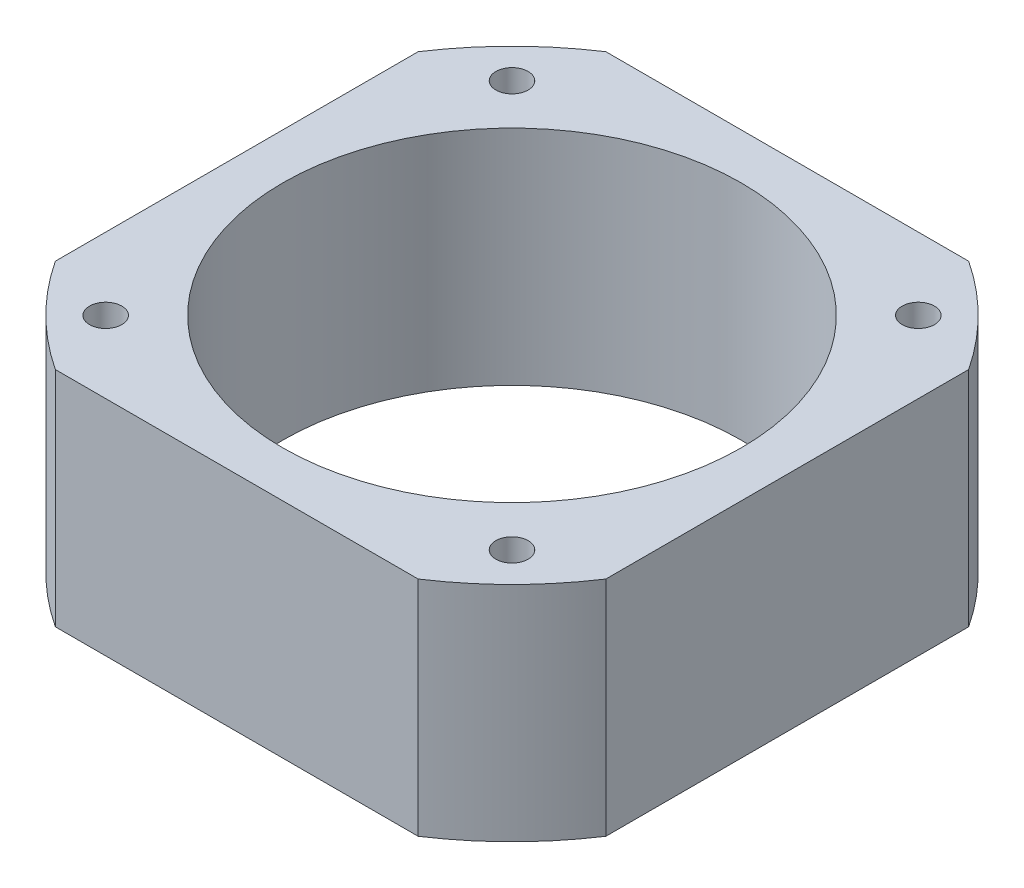
ISO-10303-21;
HEADER;
FILE_DESCRIPTION(('STEP AP214'),'2;1');
FILE_NAME('part.step','',(''),(''),'','','');
FILE_SCHEMA(('AUTOMOTIVE_DESIGN { 1 0 10303 214 1 1 1 1 }'));
ENDSEC;
DATA;
#1=APPLICATION_CONTEXT('core data for automotive mechanical design processes');
#2=APPLICATION_PROTOCOL_DEFINITION('international standard','automotive_design',2000,#1);
#3=PRODUCT_CONTEXT('',#1,'mechanical');
#4=PRODUCT('Part','Part','',(#3));
#5=PRODUCT_RELATED_PRODUCT_CATEGORY('part','',(#4));
#6=PRODUCT_DEFINITION_FORMATION('','',#4);
#7=PRODUCT_DEFINITION_CONTEXT('part definition',#1,'design');
#8=PRODUCT_DEFINITION('design','',#6,#7);
#9=PRODUCT_DEFINITION_SHAPE('','',#8);
#10=(LENGTH_UNIT() NAMED_UNIT(*) SI_UNIT(.MILLI.,.METRE.));
#11=(NAMED_UNIT(*) PLANE_ANGLE_UNIT() SI_UNIT($,.RADIAN.));
#12=(NAMED_UNIT(*) SI_UNIT($,.STERADIAN.) SOLID_ANGLE_UNIT());
#13=UNCERTAINTY_MEASURE_WITH_UNIT(LENGTH_MEASURE(1.E-05),#10,'distance_accuracy_value','');
#14=(GEOMETRIC_REPRESENTATION_CONTEXT(3) GLOBAL_UNCERTAINTY_ASSIGNED_CONTEXT((#13)) GLOBAL_UNIT_ASSIGNED_CONTEXT((#10,
#11,#12)) REPRESENTATION_CONTEXT('',''));
#15=CARTESIAN_POINT('',(0.,0.,0.));
#16=DIRECTION('',(0.,0.,1.));
#17=DIRECTION('',(1.,0.,0.));
#18=AXIS2_PLACEMENT_3D('',#15,#16,#17);
#19=CARTESIAN_POINT('',(15.5,0.,15.5));
#20=DIRECTION('',(0.,-1.,0.));
#21=DIRECTION('',(1.,0.,0.));
#22=AXIS2_PLACEMENT_3D('',#19,#20,#21);
#23=CYLINDRICAL_SURFACE('',#22,1.23);
#24=DIRECTION('',(0.,1.,0.));
#25=VECTOR('',#24,1.);
#26=CARTESIAN_POINT('',(16.73,0.,15.5));
#27=LINE('',#26,#25);
#28=CARTESIAN_POINT('',(16.73,0.,15.5));
#29=VERTEX_POINT('',#28);
#30=CARTESIAN_POINT('',(16.73,17.,15.5));
#31=VERTEX_POINT('',#30);
#32=EDGE_CURVE('E11',#29,#31,#27,.T.);
#33=ORIENTED_EDGE('',*,*,#32,.T.);
#34=CARTESIAN_POINT('',(15.5,17.,15.5));
#35=DIRECTION('',(0.,-1.,0.));
#36=DIRECTION('',(1.,0.,0.));
#37=AXIS2_PLACEMENT_3D('',#34,#35,#36);
#38=CIRCLE('',#37,1.23);
#39=EDGE_CURVE('E238',#31,#31,#38,.T.);
#40=ORIENTED_EDGE('',*,*,#39,.F.);
#41=ORIENTED_EDGE('',*,*,#32,.F.);
#42=CARTESIAN_POINT('',(15.5,0.,15.5));
#43=DIRECTION('',(0.,-1.,0.));
#44=DIRECTION('',(1.,0.,0.));
#45=AXIS2_PLACEMENT_3D('',#42,#43,#44);
#46=CIRCLE('',#45,1.23);
#47=EDGE_CURVE('E220',#29,#29,#46,.T.);
#48=ORIENTED_EDGE('',*,*,#47,.T.);
#49=EDGE_LOOP('',(#33,#40,#41,#48));
#50=FACE_BOUND('',#49,.T.);
#51=ADVANCED_FACE('F17',(#50),#23,.F.);
#52=CARTESIAN_POINT('',(0.,0.,0.));
#53=DIRECTION('',(0.,-1.,0.));
#54=DIRECTION('',(1.,0.,0.));
#55=AXIS2_PLACEMENT_3D('',#52,#53,#54);
#56=CYLINDRICAL_SURFACE('',#55,17.5);
#57=DIRECTION('',(0.,1.,0.));
#58=VECTOR('',#57,1.);
#59=CARTESIAN_POINT('',(17.5,0.,0.));
#60=LINE('',#59,#58);
#61=CARTESIAN_POINT('',(17.5,0.,0.));
#62=VERTEX_POINT('',#61);
#63=CARTESIAN_POINT('',(17.5,17.,0.));
#64=VERTEX_POINT('',#63);
#65=EDGE_CURVE('E28',#62,#64,#60,.T.);
#66=ORIENTED_EDGE('',*,*,#65,.T.);
#67=CARTESIAN_POINT('',(0.,17.,0.));
#68=DIRECTION('',(0.,1.,0.));
#69=DIRECTION('',(1.,0.,0.));
#70=AXIS2_PLACEMENT_3D('',#67,#68,#69);
#71=CIRCLE('',#70,17.5);
#72=EDGE_CURVE('E235',#64,#64,#71,.T.);
#73=ORIENTED_EDGE('',*,*,#72,.T.);
#74=ORIENTED_EDGE('',*,*,#65,.F.);
#75=CARTESIAN_POINT('',(0.,0.,0.));
#76=DIRECTION('',(0.,1.,0.));
#77=DIRECTION('',(1.,0.,0.));
#78=AXIS2_PLACEMENT_3D('',#75,#76,#77);
#79=CIRCLE('',#78,17.5);
#80=EDGE_CURVE('E248',#62,#62,#79,.T.);
#81=ORIENTED_EDGE('',*,*,#80,.F.);
#82=EDGE_LOOP('',(#66,#73,#74,#81));
#83=FACE_BOUND('',#82,.T.);
#84=ADVANCED_FACE('F528',(#83),#56,.F.);
#85=CARTESIAN_POINT('',(15.5,0.,-15.5));
#86=DIRECTION('',(0.,-1.,0.));
#87=DIRECTION('',(1.,0.,0.));
#88=AXIS2_PLACEMENT_3D('',#85,#86,#87);
#89=CYLINDRICAL_SURFACE('',#88,1.23);
#90=DIRECTION('',(0.,1.,0.));
#91=VECTOR('',#90,1.);
#92=CARTESIAN_POINT('',(16.73,0.,-15.5));
#93=LINE('',#92,#91);
#94=CARTESIAN_POINT('',(16.73,0.,-15.5));
#95=VERTEX_POINT('',#94);
#96=CARTESIAN_POINT('',(16.73,17.,-15.5));
#97=VERTEX_POINT('',#96);
#98=EDGE_CURVE('E69',#95,#97,#93,.T.);
#99=ORIENTED_EDGE('',*,*,#98,.T.);
#100=CARTESIAN_POINT('',(15.5,17.,-15.5));
#101=DIRECTION('',(0.,-1.,0.));
#102=DIRECTION('',(1.,0.,0.));
#103=AXIS2_PLACEMENT_3D('',#100,#101,#102);
#104=CIRCLE('',#103,1.23);
#105=EDGE_CURVE('E206',#97,#97,#104,.T.);
#106=ORIENTED_EDGE('',*,*,#105,.F.);
#107=ORIENTED_EDGE('',*,*,#98,.F.);
#108=CARTESIAN_POINT('',(15.5,0.,-15.5));
#109=DIRECTION('',(0.,-1.,0.));
#110=DIRECTION('',(1.,0.,0.));
#111=AXIS2_PLACEMENT_3D('',#108,#109,#110);
#112=CIRCLE('',#111,1.23);
#113=EDGE_CURVE('E245',#95,#95,#112,.T.);
#114=ORIENTED_EDGE('',*,*,#113,.T.);
#115=EDGE_LOOP('',(#99,#106,#107,#114));
#116=FACE_BOUND('',#115,.T.);
#117=ADVANCED_FACE('F19',(#116),#89,.F.);
#118=CARTESIAN_POINT('',(-15.5,0.,15.5));
#119=DIRECTION('',(0.,-1.,0.));
#120=DIRECTION('',(1.,0.,0.));
#121=AXIS2_PLACEMENT_3D('',#118,#119,#120);
#122=CYLINDRICAL_SURFACE('',#121,1.23);
#123=DIRECTION('',(0.,1.,0.));
#124=VECTOR('',#123,1.);
#125=CARTESIAN_POINT('',(-14.27,0.,15.5));
#126=LINE('',#125,#124);
#127=CARTESIAN_POINT('',(-14.27,0.,15.5));
#128=VERTEX_POINT('',#127);
#129=CARTESIAN_POINT('',(-14.27,17.,15.5));
#130=VERTEX_POINT('',#129);
#131=EDGE_CURVE('E81',#128,#130,#126,.T.);
#132=ORIENTED_EDGE('',*,*,#131,.T.);
#133=CARTESIAN_POINT('',(-15.5,17.,15.5));
#134=DIRECTION('',(0.,-1.,0.));
#135=DIRECTION('',(1.,0.,0.));
#136=AXIS2_PLACEMENT_3D('',#133,#134,#135);
#137=CIRCLE('',#136,1.23);
#138=EDGE_CURVE('E204',#130,#130,#137,.T.);
#139=ORIENTED_EDGE('',*,*,#138,.F.);
#140=ORIENTED_EDGE('',*,*,#131,.F.);
#141=CARTESIAN_POINT('',(-15.5,0.,15.5));
#142=DIRECTION('',(0.,-1.,0.));
#143=DIRECTION('',(1.,0.,0.));
#144=AXIS2_PLACEMENT_3D('',#141,#142,#143);
#145=CIRCLE('',#144,1.23);
#146=EDGE_CURVE('E249',#128,#128,#145,.T.);
#147=ORIENTED_EDGE('',*,*,#146,.T.);
#148=EDGE_LOOP('',(#132,#139,#140,#147));
#149=FACE_BOUND('',#148,.T.);
#150=ADVANCED_FACE('F510',(#149),#122,.F.);
#151=CARTESIAN_POINT('',(-15.5,0.,-15.5));
#152=DIRECTION('',(0.,-1.,0.));
#153=DIRECTION('',(1.,0.,0.));
#154=AXIS2_PLACEMENT_3D('',#151,#152,#153);
#155=CYLINDRICAL_SURFACE('',#154,1.23);
#156=DIRECTION('',(0.,1.,0.));
#157=VECTOR('',#156,1.);
#158=CARTESIAN_POINT('',(-14.27,0.,-15.5));
#159=LINE('',#158,#157);
#160=CARTESIAN_POINT('',(-14.27,0.,-15.5));
#161=VERTEX_POINT('',#160);
#162=CARTESIAN_POINT('',(-14.27,17.,-15.5));
#163=VERTEX_POINT('',#162);
#164=EDGE_CURVE('E258',#161,#163,#159,.T.);
#165=ORIENTED_EDGE('',*,*,#164,.T.);
#166=CARTESIAN_POINT('',(-15.5,17.,-15.5));
#167=DIRECTION('',(0.,-1.,0.));
#168=DIRECTION('',(1.,0.,0.));
#169=AXIS2_PLACEMENT_3D('',#166,#167,#168);
#170=CIRCLE('',#169,1.23);
#171=EDGE_CURVE('E207',#163,#163,#170,.T.);
#172=ORIENTED_EDGE('',*,*,#171,.F.);
#173=ORIENTED_EDGE('',*,*,#164,.F.);
#174=CARTESIAN_POINT('',(-15.5,0.,-15.5));
#175=DIRECTION('',(0.,-1.,0.));
#176=DIRECTION('',(1.,0.,0.));
#177=AXIS2_PLACEMENT_3D('',#174,#175,#176);
#178=CIRCLE('',#177,1.23);
#179=EDGE_CURVE('E213',#161,#161,#178,.T.);
#180=ORIENTED_EDGE('',*,*,#179,.T.);
#181=EDGE_LOOP('',(#165,#172,#173,#180));
#182=FACE_BOUND('',#181,.T.);
#183=ADVANCED_FACE('F501',(#182),#155,.F.);
#184=CARTESIAN_POINT('',(-13.83916543726,0.,21.));
#185=DIRECTION('',(0.,0.,-1.));
#186=DIRECTION('',(-1.,0.,0.));
#187=AXIS2_PLACEMENT_3D('',#184,#185,#186);
#188=PLANE('',#187);
#189=DIRECTION('',(1.,0.,0.));
#190=VECTOR('',#189,1.);
#191=CARTESIAN_POINT('',(-13.83916543726,0.,21.));
#192=LINE('',#191,#190);
#193=CARTESIAN_POINT('',(-13.83916543726,0.,21.));
#194=VERTEX_POINT('',#193);
#195=CARTESIAN_POINT('',(13.839165437265,0.,21.));
#196=VERTEX_POINT('',#195);
#197=EDGE_CURVE('E203',#194,#196,#192,.T.);
#198=ORIENTED_EDGE('',*,*,#197,.T.);
#199=DIRECTION('',(0.,1.,0.));
#200=VECTOR('',#199,1.);
#201=CARTESIAN_POINT('',(13.839165437265,0.,21.));
#202=LINE('',#201,#200);
#203=CARTESIAN_POINT('',(13.839165437265,17.,21.));
#204=VERTEX_POINT('',#203);
#205=EDGE_CURVE('E196',#196,#204,#202,.T.);
#206=ORIENTED_EDGE('',*,*,#205,.T.);
#207=DIRECTION('',(1.,0.,0.));
#208=VECTOR('',#207,1.);
#209=CARTESIAN_POINT('',(-13.83916543726,17.,21.));
#210=LINE('',#209,#208);
#211=CARTESIAN_POINT('',(-13.83916543726,17.,21.));
#212=VERTEX_POINT('',#211);
#213=EDGE_CURVE('E189',#212,#204,#210,.T.);
#214=ORIENTED_EDGE('',*,*,#213,.F.);
#215=DIRECTION('',(0.,1.,0.));
#216=VECTOR('',#215,1.);
#217=CARTESIAN_POINT('',(-13.83916543726,0.,21.));
#218=LINE('',#217,#216);
#219=EDGE_CURVE('E199',#194,#212,#218,.T.);
#220=ORIENTED_EDGE('',*,*,#219,.F.);
#221=EDGE_LOOP('',(#198,#206,#214,#220));
#222=FACE_BOUND('',#221,.T.);
#223=ADVANCED_FACE('F300',(#222),#188,.F.);
#224=CARTESIAN_POINT('',(0.,0.,0.));
#225=DIRECTION('',(0.,-1.,0.));
#226=DIRECTION('',(1.,0.,0.));
#227=AXIS2_PLACEMENT_3D('',#224,#225,#226);
#228=CYLINDRICAL_SURFACE('',#227,25.15);
#229=CARTESIAN_POINT('',(0.,0.,0.));
#230=DIRECTION('',(0.,1.,0.));
#231=DIRECTION('',(1.,0.,0.));
#232=AXIS2_PLACEMENT_3D('',#229,#230,#231);
#233=CIRCLE('',#232,25.15);
#234=CARTESIAN_POINT('',(-21.,0.,13.839165437265));
#235=VERTEX_POINT('',#234);
#236=EDGE_CURVE('E214',#235,#194,#233,.T.);
#237=ORIENTED_EDGE('',*,*,#236,.T.);
#238=ORIENTED_EDGE('',*,*,#219,.T.);
#239=CARTESIAN_POINT('',(0.,17.,0.));
#240=DIRECTION('',(0.,1.,0.));
#241=DIRECTION('',(1.,0.,0.));
#242=AXIS2_PLACEMENT_3D('',#239,#240,#241);
#243=CIRCLE('',#242,25.15);
#244=CARTESIAN_POINT('',(-21.,17.,13.839165437265));
#245=VERTEX_POINT('',#244);
#246=EDGE_CURVE('E219',#245,#212,#243,.T.);
#247=ORIENTED_EDGE('',*,*,#246,.F.);
#248=DIRECTION('',(0.,1.,0.));
#249=VECTOR('',#248,1.);
#250=CARTESIAN_POINT('',(-21.,0.,13.839165437265));
#251=LINE('',#250,#249);
#252=EDGE_CURVE('E200',#235,#245,#251,.T.);
#253=ORIENTED_EDGE('',*,*,#252,.F.);
#254=EDGE_LOOP('',(#237,#238,#247,#253));
#255=FACE_BOUND('',#254,.T.);
#256=ADVANCED_FACE('F293',(#255),#228,.T.);
#257=CARTESIAN_POINT('',(0.,0.,0.));
#258=DIRECTION('',(0.,-1.,0.));
#259=DIRECTION('',(1.,0.,0.));
#260=AXIS2_PLACEMENT_3D('',#257,#258,#259);
#261=CYLINDRICAL_SURFACE('',#260,25.15);
#262=CARTESIAN_POINT('',(0.,0.,0.));
#263=DIRECTION('',(0.,1.,0.));
#264=DIRECTION('',(1.,0.,0.));
#265=AXIS2_PLACEMENT_3D('',#262,#263,#264);
#266=CIRCLE('',#265,25.15);
#267=CARTESIAN_POINT('',(21.,0.,13.839165437265));
#268=VERTEX_POINT('',#267);
#269=EDGE_CURVE('E167',#196,#268,#266,.T.);
#270=ORIENTED_EDGE('',*,*,#269,.T.);
#271=DIRECTION('',(0.,1.,0.));
#272=VECTOR('',#271,1.);
#273=CARTESIAN_POINT('',(21.,0.,13.839165437265));
#274=LINE('',#273,#272);
#275=CARTESIAN_POINT('',(21.,17.,13.839165437265));
#276=VERTEX_POINT('',#275);
#277=EDGE_CURVE('E163',#268,#276,#274,.T.);
#278=ORIENTED_EDGE('',*,*,#277,.T.);
#279=CARTESIAN_POINT('',(0.,17.,0.));
#280=DIRECTION('',(0.,1.,0.));
#281=DIRECTION('',(1.,0.,0.));
#282=AXIS2_PLACEMENT_3D('',#279,#280,#281);
#283=CIRCLE('',#282,25.15);
#284=EDGE_CURVE('E191',#204,#276,#283,.T.);
#285=ORIENTED_EDGE('',*,*,#284,.F.);
#286=ORIENTED_EDGE('',*,*,#205,.F.);
#287=EDGE_LOOP('',(#270,#278,#285,#286));
#288=FACE_BOUND('',#287,.T.);
#289=ADVANCED_FACE('F473',(#288),#261,.T.);
#290=CARTESIAN_POINT('',(-21.,0.,-13.83916543726));
#291=DIRECTION('',(1.,0.,0.));
#292=DIRECTION('',(0.,1.,0.));
#293=AXIS2_PLACEMENT_3D('',#290,#291,#292);
#294=PLANE('',#293);
#295=DIRECTION('',(0.,0.,1.));
#296=VECTOR('',#295,1.);
#297=CARTESIAN_POINT('',(-21.,0.,-13.83916543726));
#298=LINE('',#297,#296);
#299=CARTESIAN_POINT('',(-21.,0.,-13.83916543726));
#300=VERTEX_POINT('',#299);
#301=EDGE_CURVE('E209',#300,#235,#298,.T.);
#302=ORIENTED_EDGE('',*,*,#301,.T.);
#303=ORIENTED_EDGE('',*,*,#252,.T.);
#304=DIRECTION('',(0.,0.,1.));
#305=VECTOR('',#304,1.);
#306=CARTESIAN_POINT('',(-21.,17.,-13.83916543726));
#307=LINE('',#306,#305);
#308=CARTESIAN_POINT('',(-21.,17.,-13.83916543726));
#309=VERTEX_POINT('',#308);
#310=EDGE_CURVE('E215',#309,#245,#307,.T.);
#311=ORIENTED_EDGE('',*,*,#310,.F.);
#312=DIRECTION('',(0.,1.,0.));
#313=VECTOR('',#312,1.);
#314=CARTESIAN_POINT('',(-21.,0.,-13.83916543726));
#315=LINE('',#314,#313);
#316=EDGE_CURVE('E244',#300,#309,#315,.T.);
#317=ORIENTED_EDGE('',*,*,#316,.F.);
#318=EDGE_LOOP('',(#302,#303,#311,#317));
#319=FACE_BOUND('',#318,.T.);
#320=ADVANCED_FACE('F308',(#319),#294,.F.);
#321=CARTESIAN_POINT('',(21.,0.,13.839165437265));
#322=DIRECTION('',(-1.,0.,0.));
#323=DIRECTION('',(0.,0.,1.));
#324=AXIS2_PLACEMENT_3D('',#321,#322,#323);
#325=PLANE('',#324);
#326=DIRECTION('',(0.,0.,-1.));
#327=VECTOR('',#326,1.);
#328=CARTESIAN_POINT('',(21.,0.,13.839165437265));
#329=LINE('',#328,#327);
#330=CARTESIAN_POINT('',(21.,0.,-13.83916543726));
#331=VERTEX_POINT('',#330);
#332=EDGE_CURVE('E158',#268,#331,#329,.T.);
#333=ORIENTED_EDGE('',*,*,#332,.T.);
#334=DIRECTION('',(0.,1.,0.));
#335=VECTOR('',#334,1.);
#336=CARTESIAN_POINT('',(21.,0.,-13.83916543726));
#337=LINE('',#336,#335);
#338=CARTESIAN_POINT('',(21.,17.,-13.83916543726));
#339=VERTEX_POINT('',#338);
#340=EDGE_CURVE('E21',#331,#339,#337,.T.);
#341=ORIENTED_EDGE('',*,*,#340,.T.);
#342=DIRECTION('',(0.,0.,-1.));
#343=VECTOR('',#342,1.);
#344=CARTESIAN_POINT('',(21.,17.,13.839165437265));
#345=LINE('',#344,#343);
#346=EDGE_CURVE('E195',#276,#339,#345,.T.);
#347=ORIENTED_EDGE('',*,*,#346,.F.);
#348=ORIENTED_EDGE('',*,*,#277,.F.);
#349=EDGE_LOOP('',(#333,#341,#347,#348));
#350=FACE_BOUND('',#349,.T.);
#351=ADVANCED_FACE('F159',(#350),#325,.F.);
#352=CARTESIAN_POINT('',(0.,17.,0.));
#353=DIRECTION('',(0.,1.,0.));
#354=DIRECTION('',(0.,0.,-1.));
#355=AXIS2_PLACEMENT_3D('',#352,#353,#354);
#356=PLANE('',#355);
#357=ORIENTED_EDGE('',*,*,#39,.T.);
#358=EDGE_LOOP('',(#357));
#359=FACE_BOUND('',#358,.T.);
#360=ORIENTED_EDGE('',*,*,#72,.F.);
#361=EDGE_LOOP('',(#360));
#362=FACE_BOUND('',#361,.T.);
#363=ORIENTED_EDGE('',*,*,#105,.T.);
#364=EDGE_LOOP('',(#363));
#365=FACE_BOUND('',#364,.T.);
#366=ORIENTED_EDGE('',*,*,#138,.T.);
#367=EDGE_LOOP('',(#366));
#368=FACE_BOUND('',#367,.T.);
#369=ORIENTED_EDGE('',*,*,#171,.T.);
#370=EDGE_LOOP('',(#369));
#371=FACE_BOUND('',#370,.T.);
#372=DIRECTION('',(-1.,0.,0.));
#373=VECTOR('',#372,1.);
#374=CARTESIAN_POINT('',(13.839165437265,17.,-21.));
#375=LINE('',#374,#373);
#376=CARTESIAN_POINT('',(13.839165437265,17.,-21.));
#377=VERTEX_POINT('',#376);
#378=CARTESIAN_POINT('',(-13.83916543726,17.,-21.));
#379=VERTEX_POINT('',#378);
#380=EDGE_CURVE('E185',#377,#379,#375,.T.);
#381=ORIENTED_EDGE('',*,*,#380,.T.);
#382=CARTESIAN_POINT('',(0.,17.,0.));
#383=DIRECTION('',(0.,1.,0.));
#384=DIRECTION('',(1.,0.,0.));
#385=AXIS2_PLACEMENT_3D('',#382,#383,#384);
#386=CIRCLE('',#385,25.15);
#387=EDGE_CURVE('E168',#379,#309,#386,.T.);
#388=ORIENTED_EDGE('',*,*,#387,.T.);
#389=ORIENTED_EDGE('',*,*,#310,.T.);
#390=ORIENTED_EDGE('',*,*,#246,.T.);
#391=ORIENTED_EDGE('',*,*,#213,.T.);
#392=ORIENTED_EDGE('',*,*,#284,.T.);
#393=ORIENTED_EDGE('',*,*,#346,.T.);
#394=CARTESIAN_POINT('',(0.,17.,0.));
#395=DIRECTION('',(0.,1.,0.));
#396=DIRECTION('',(1.,0.,0.));
#397=AXIS2_PLACEMENT_3D('',#394,#395,#396);
#398=CIRCLE('',#397,25.15);
#399=EDGE_CURVE('E171',#339,#377,#398,.T.);
#400=ORIENTED_EDGE('',*,*,#399,.T.);
#401=EDGE_LOOP('',(#381,#388,#389,#390,#391,#392,#393,#400));
#402=FACE_BOUND('',#401,.T.);
#403=ADVANCED_FACE('F304',(#359,#362,#365,#368,#371,#402),#356,.T.);
#404=CARTESIAN_POINT('',(0.,0.,0.));
#405=DIRECTION('',(0.,1.,0.));
#406=DIRECTION('',(0.,0.,-1.));
#407=AXIS2_PLACEMENT_3D('',#404,#405,#406);
#408=PLANE('',#407);
#409=ORIENTED_EDGE('',*,*,#47,.F.);
#410=EDGE_LOOP('',(#409));
#411=FACE_BOUND('',#410,.T.);
#412=ORIENTED_EDGE('',*,*,#80,.T.);
#413=EDGE_LOOP('',(#412));
#414=FACE_BOUND('',#413,.T.);
#415=ORIENTED_EDGE('',*,*,#113,.F.);
#416=EDGE_LOOP('',(#415));
#417=FACE_BOUND('',#416,.T.);
#418=ORIENTED_EDGE('',*,*,#146,.F.);
#419=EDGE_LOOP('',(#418));
#420=FACE_BOUND('',#419,.T.);
#421=ORIENTED_EDGE('',*,*,#179,.F.);
#422=EDGE_LOOP('',(#421));
#423=FACE_BOUND('',#422,.T.);
#424=CARTESIAN_POINT('',(0.,0.,0.));
#425=DIRECTION('',(0.,1.,0.));
#426=DIRECTION('',(1.,0.,0.));
#427=AXIS2_PLACEMENT_3D('',#424,#425,#426);
#428=CIRCLE('',#427,25.15);
#429=CARTESIAN_POINT('',(13.839165437265,0.,-21.));
#430=VERTEX_POINT('',#429);
#431=EDGE_CURVE('E123',#331,#430,#428,.T.);
#432=ORIENTED_EDGE('',*,*,#431,.F.);
#433=ORIENTED_EDGE('',*,*,#332,.F.);
#434=ORIENTED_EDGE('',*,*,#269,.F.);
#435=ORIENTED_EDGE('',*,*,#197,.F.);
#436=ORIENTED_EDGE('',*,*,#236,.F.);
#437=ORIENTED_EDGE('',*,*,#301,.F.);
#438=CARTESIAN_POINT('',(0.,0.,0.));
#439=DIRECTION('',(0.,1.,0.));
#440=DIRECTION('',(1.,0.,0.));
#441=AXIS2_PLACEMENT_3D('',#438,#439,#440);
#442=CIRCLE('',#441,25.15);
#443=CARTESIAN_POINT('',(-13.83916543726,0.,-21.));
#444=VERTEX_POINT('',#443);
#445=EDGE_CURVE('E109',#444,#300,#442,.T.);
#446=ORIENTED_EDGE('',*,*,#445,.F.);
#447=DIRECTION('',(-1.,0.,0.));
#448=VECTOR('',#447,1.);
#449=CARTESIAN_POINT('',(13.839165437265,0.,-21.));
#450=LINE('',#449,#448);
#451=EDGE_CURVE('E175',#430,#444,#450,.T.);
#452=ORIENTED_EDGE('',*,*,#451,.F.);
#453=EDGE_LOOP('',(#432,#433,#434,#435,#436,#437,#446,#452));
#454=FACE_BOUND('',#453,.T.);
#455=ADVANCED_FACE('F173',(#411,#414,#417,#420,#423,#454),#408,.F.);
#456=CARTESIAN_POINT('',(0.,0.,0.));
#457=DIRECTION('',(0.,-1.,0.));
#458=DIRECTION('',(1.,0.,0.));
#459=AXIS2_PLACEMENT_3D('',#456,#457,#458);
#460=CYLINDRICAL_SURFACE('',#459,25.15);
#461=ORIENTED_EDGE('',*,*,#445,.T.);
#462=ORIENTED_EDGE('',*,*,#316,.T.);
#463=ORIENTED_EDGE('',*,*,#387,.F.);
#464=DIRECTION('',(0.,1.,0.));
#465=VECTOR('',#464,1.);
#466=CARTESIAN_POINT('',(-13.83916543726,0.,-21.));
#467=LINE('',#466,#465);
#468=EDGE_CURVE('E227',#444,#379,#467,.T.);
#469=ORIENTED_EDGE('',*,*,#468,.F.);
#470=EDGE_LOOP('',(#461,#462,#463,#469));
#471=FACE_BOUND('',#470,.T.);
#472=ADVANCED_FACE('F420',(#471),#460,.T.);
#473=CARTESIAN_POINT('',(0.,0.,0.));
#474=DIRECTION('',(0.,-1.,0.));
#475=DIRECTION('',(1.,0.,0.));
#476=AXIS2_PLACEMENT_3D('',#473,#474,#475);
#477=CYLINDRICAL_SURFACE('',#476,25.15);
#478=ORIENTED_EDGE('',*,*,#431,.T.);
#479=DIRECTION('',(0.,1.,0.));
#480=VECTOR('',#479,1.);
#481=CARTESIAN_POINT('',(13.839165437265,0.,-21.));
#482=LINE('',#481,#480);
#483=EDGE_CURVE('E177',#430,#377,#482,.T.);
#484=ORIENTED_EDGE('',*,*,#483,.T.);
#485=ORIENTED_EDGE('',*,*,#399,.F.);
#486=ORIENTED_EDGE('',*,*,#340,.F.);
#487=EDGE_LOOP('',(#478,#484,#485,#486));
#488=FACE_BOUND('',#487,.T.);
#489=ADVANCED_FACE('F170',(#488),#477,.T.);
#490=CARTESIAN_POINT('',(13.839165437265,0.,-21.));
#491=DIRECTION('',(0.,0.,1.));
#492=DIRECTION('',(0.,-1.,0.));
#493=AXIS2_PLACEMENT_3D('',#490,#491,#492);
#494=PLANE('',#493);
#495=ORIENTED_EDGE('',*,*,#451,.T.);
#496=ORIENTED_EDGE('',*,*,#468,.T.);
#497=ORIENTED_EDGE('',*,*,#380,.F.);
#498=ORIENTED_EDGE('',*,*,#483,.F.);
#499=EDGE_LOOP('',(#495,#496,#497,#498));
#500=FACE_BOUND('',#499,.T.);
#501=ADVANCED_FACE('F403',(#500),#494,.F.);
#502=CLOSED_SHELL('',(#51,#84,#117,#150,#183,#223,#256,#289,#320,#351,#403,#455,#472,#489,#501));
#503=MANIFOLD_SOLID_BREP('B1',#502);
#504=ADVANCED_BREP_SHAPE_REPRESENTATION('',(#18,#503),#14);
#505=SHAPE_DEFINITION_REPRESENTATION(#9,#504);
ENDSEC;
END-ISO-10303-21;
